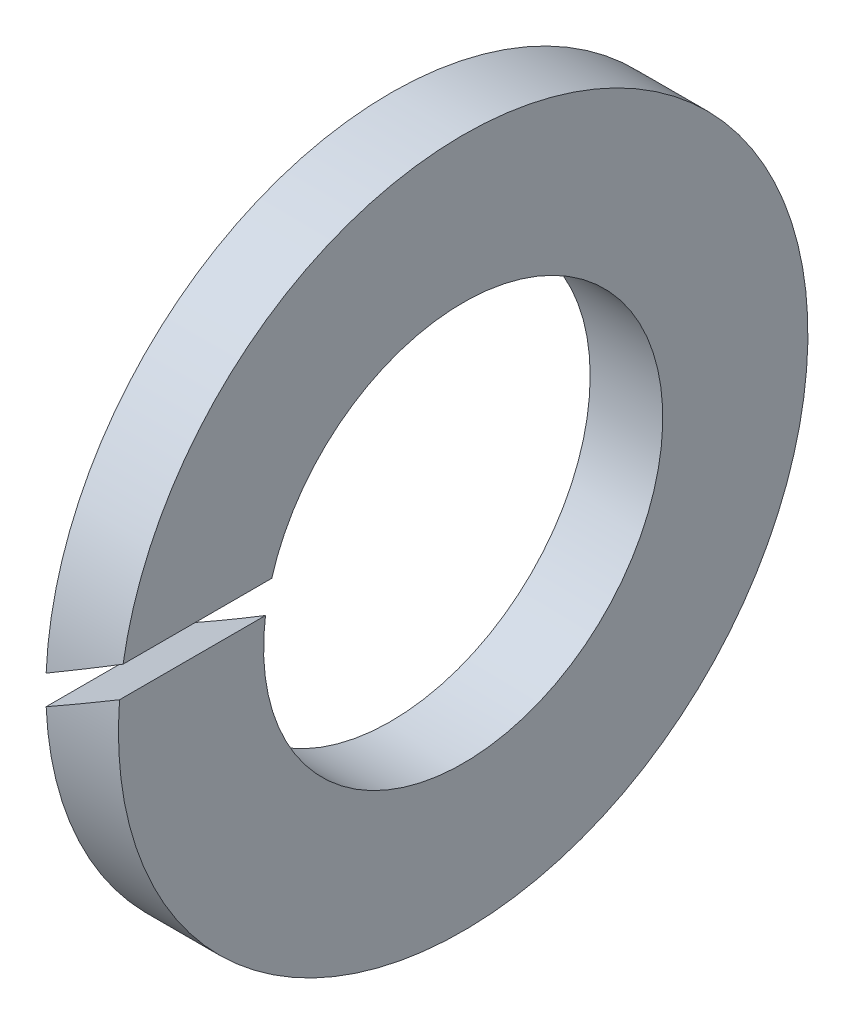
ISO-10303-21;
HEADER;
FILE_DESCRIPTION(('STEP AP214'),'2;1');
FILE_NAME('part.step','',(''),(''),'','','');
FILE_SCHEMA(('AUTOMOTIVE_DESIGN { 1 0 10303 214 1 1 1 1 }'));
ENDSEC;
DATA;
#1=APPLICATION_CONTEXT('core data for automotive mechanical design processes');
#2=APPLICATION_PROTOCOL_DEFINITION('international standard','automotive_design',2000,#1);
#3=PRODUCT_CONTEXT('',#1,'mechanical');
#4=PRODUCT('Part','Part','',(#3));
#5=PRODUCT_RELATED_PRODUCT_CATEGORY('part','',(#4));
#6=PRODUCT_DEFINITION_FORMATION('','',#4);
#7=PRODUCT_DEFINITION_CONTEXT('part definition',#1,'design');
#8=PRODUCT_DEFINITION('design','',#6,#7);
#9=PRODUCT_DEFINITION_SHAPE('','',#8);
#10=(LENGTH_UNIT() NAMED_UNIT(*) SI_UNIT(.MILLI.,.METRE.));
#11=(NAMED_UNIT(*) PLANE_ANGLE_UNIT() SI_UNIT($,.RADIAN.));
#12=(NAMED_UNIT(*) SI_UNIT($,.STERADIAN.) SOLID_ANGLE_UNIT());
#13=UNCERTAINTY_MEASURE_WITH_UNIT(LENGTH_MEASURE(1.E-05),#10,'distance_accuracy_value','');
#14=(GEOMETRIC_REPRESENTATION_CONTEXT(3) GLOBAL_UNCERTAINTY_ASSIGNED_CONTEXT((#13)) GLOBAL_UNIT_ASSIGNED_CONTEXT((#10,
#11,#12)) REPRESENTATION_CONTEXT('',''));
#15=CARTESIAN_POINT('',(0.,0.,0.));
#16=DIRECTION('',(0.,0.,1.));
#17=DIRECTION('',(1.,0.,0.));
#18=AXIS2_PLACEMENT_3D('',#15,#16,#17);
#19=CARTESIAN_POINT('',(0.799999999999999,0.,0.));
#20=DIRECTION('',(-1.,0.,0.));
#21=DIRECTION('',(0.,0.,1.));
#22=AXIS2_PLACEMENT_3D('',#19,#20,#21);
#23=PLANE('',#22);
#24=DIRECTION('',(0.,0.,1.));
#25=VECTOR('',#24,1.);
#26=CARTESIAN_POINT('',(0.799999999999999,0.621880215351698,0.));
#27=LINE('',#26,#25);
#28=CARTESIAN_POINT('',(0.800000000000001,0.6218802153517,2.11027604776108));
#29=VERTEX_POINT('',#28);
#30=CARTESIAN_POINT('',(0.800000000000001,0.6218802153517,3.74876846414314));
#31=VERTEX_POINT('',#30);
#32=EDGE_CURVE('E54',#29,#31,#27,.T.);
#33=ORIENTED_EDGE('',*,*,#32,.F.);
#34=CARTESIAN_POINT('',(0.800000000000002,0.,0.));
#35=DIRECTION('',(1.,0.,0.));
#36=DIRECTION('',(0.,0.,-1.));
#37=AXIS2_PLACEMENT_3D('',#34,#35,#36);
#38=CIRCLE('',#37,2.2);
#39=CARTESIAN_POINT('',(0.800000000000003,0.301880215351698,2.17918983468151));
#40=VERTEX_POINT('',#39);
#41=EDGE_CURVE('E83',#29,#40,#38,.F.);
#42=ORIENTED_EDGE('',*,*,#41,.T.);
#43=DIRECTION('',(0.,0.,1.));
#44=VECTOR('',#43,1.);
#45=CARTESIAN_POINT('',(0.800000000000004,0.301880215351698,0.));
#46=LINE('',#45,#44);
#47=CARTESIAN_POINT('',(0.800000000000003,0.301880215351698,3.78799001260289));
#48=VERTEX_POINT('',#47);
#49=EDGE_CURVE('E85',#40,#48,#46,.T.);
#50=ORIENTED_EDGE('',*,*,#49,.T.);
#51=CARTESIAN_POINT('',(0.800000000000002,0.,0.));
#52=DIRECTION('',(1.,0.,0.));
#53=DIRECTION('',(0.,0.,-1.));
#54=AXIS2_PLACEMENT_3D('',#51,#52,#53);
#55=CIRCLE('',#54,3.8);
#56=EDGE_CURVE('E20',#31,#48,#55,.F.);
#57=ORIENTED_EDGE('',*,*,#56,.F.);
#58=EDGE_LOOP('',(#33,#42,#50,#57));
#59=FACE_BOUND('',#58,.T.);
#60=ADVANCED_FACE('F17',(#59),#23,.F.);
#61=CARTESIAN_POINT('',(0.,0.,0.));
#62=DIRECTION('',(1.,0.,0.));
#63=DIRECTION('',(0.,0.,-1.));
#64=AXIS2_PLACEMENT_3D('',#61,#62,#63);
#65=CYLINDRICAL_SURFACE('',#64,3.8);
#66=ORIENTED_EDGE('',*,*,#56,.T.);
#67=CARTESIAN_POINT('',(0.27712812921103,0.,0.));
#68=DIRECTION('',(0.500000000000001,-0.866025403784438,0.));
#69=DIRECTION('',(0.866025403784438,0.500000000000001,0.));
#70=AXIS2_PLACEMENT_3D('',#67,#68,#69);
#71=ELLIPSE('',#70,7.59999999999998,3.8);
#72=CARTESIAN_POINT('',(0.,-0.160000000000003,3.79663008469353));
#73=VERTEX_POINT('',#72);
#74=EDGE_CURVE('E65',#48,#73,#71,.T.);
#75=ORIENTED_EDGE('',*,*,#74,.T.);
#76=CARTESIAN_POINT('',(0.,0.,0.));
#77=DIRECTION('',(1.,0.,0.));
#78=DIRECTION('',(0.,0.,-1.));
#79=AXIS2_PLACEMENT_3D('',#76,#77,#78);
#80=CIRCLE('',#79,3.8);
#81=CARTESIAN_POINT('',(0.,0.159999999999999,3.79663008469353));
#82=VERTEX_POINT('',#81);
#83=EDGE_CURVE('E60',#82,#73,#80,.F.);
#84=ORIENTED_EDGE('',*,*,#83,.F.);
#85=CARTESIAN_POINT('',(-0.27712812921102,0.,0.));
#86=DIRECTION('',(-0.5,0.866025403784438,0.));
#87=DIRECTION('',(0.866025403784438,0.5,0.));
#88=AXIS2_PLACEMENT_3D('',#85,#86,#87);
#89=ELLIPSE('',#88,7.59999999999999,3.8);
#90=EDGE_CURVE('E63',#82,#31,#89,.T.);
#91=ORIENTED_EDGE('',*,*,#90,.T.);
#92=EDGE_LOOP('',(#66,#75,#84,#91));
#93=FACE_BOUND('',#92,.T.);
#94=ADVANCED_FACE('F62',(#93),#65,.T.);
#95=CARTESIAN_POINT('',(0.800000000000002,0.301880215351697,0.));
#96=DIRECTION('',(0.500000000000001,-0.866025403784438,0.));
#97=DIRECTION('',(0.866025403784438,0.500000000000001,0.));
#98=AXIS2_PLACEMENT_3D('',#95,#96,#97);
#99=PLANE('',#98);
#100=ORIENTED_EDGE('',*,*,#74,.F.);
#101=ORIENTED_EDGE('',*,*,#49,.F.);
#102=CARTESIAN_POINT('',(0.27712812921103,0.,0.));
#103=DIRECTION('',(0.500000000000001,-0.866025403784438,0.));
#104=DIRECTION('',(0.866025403784438,0.500000000000001,0.));
#105=AXIS2_PLACEMENT_3D('',#102,#103,#104);
#106=ELLIPSE('',#105,4.39999999999999,2.2);
#107=CARTESIAN_POINT('',(0.,-0.160000000000003,2.1941741043044));
#108=VERTEX_POINT('',#107);
#109=EDGE_CURVE('E81',#40,#108,#106,.T.);
#110=ORIENTED_EDGE('',*,*,#109,.T.);
#111=DIRECTION('',(0.,0.,1.));
#112=VECTOR('',#111,1.);
#113=CARTESIAN_POINT('',(0.,-0.16,0.));
#114=LINE('',#113,#112);
#115=EDGE_CURVE('E69',#73,#108,#114,.F.);
#116=ORIENTED_EDGE('',*,*,#115,.F.);
#117=EDGE_LOOP('',(#100,#101,#110,#116));
#118=FACE_BOUND('',#117,.T.);
#119=ADVANCED_FACE('F91',(#118),#99,.F.);
#120=CARTESIAN_POINT('',(0.,0.,0.));
#121=DIRECTION('',(1.,0.,0.));
#122=DIRECTION('',(0.,0.,-1.));
#123=AXIS2_PLACEMENT_3D('',#120,#121,#122);
#124=CYLINDRICAL_SURFACE('',#123,2.2);
#125=ORIENTED_EDGE('',*,*,#109,.F.);
#126=ORIENTED_EDGE('',*,*,#41,.F.);
#127=CARTESIAN_POINT('',(-0.27712812921102,0.,0.));
#128=DIRECTION('',(-0.5,0.866025403784438,0.));
#129=DIRECTION('',(0.866025403784438,0.5,0.));
#130=AXIS2_PLACEMENT_3D('',#127,#128,#129);
#131=ELLIPSE('',#130,4.4,2.2);
#132=CARTESIAN_POINT('',(0.,0.159999999999999,2.1941741043044));
#133=VERTEX_POINT('',#132);
#134=EDGE_CURVE('E35',#29,#133,#131,.F.);
#135=ORIENTED_EDGE('',*,*,#134,.T.);
#136=CARTESIAN_POINT('',(0.,0.,0.));
#137=DIRECTION('',(1.,0.,0.));
#138=DIRECTION('',(0.,0.,-1.));
#139=AXIS2_PLACEMENT_3D('',#136,#137,#138);
#140=CIRCLE('',#139,2.2);
#141=EDGE_CURVE('E26',#108,#133,#140,.T.);
#142=ORIENTED_EDGE('',*,*,#141,.F.);
#143=EDGE_LOOP('',(#125,#126,#135,#142));
#144=FACE_BOUND('',#143,.T.);
#145=ADVANCED_FACE('F89',(#144),#124,.F.);
#146=CARTESIAN_POINT('',(0.,0.16,0.));
#147=DIRECTION('',(-0.5,0.866025403784438,0.));
#148=DIRECTION('',(-0.866025403784438,-0.5,0.));
#149=AXIS2_PLACEMENT_3D('',#146,#147,#148);
#150=PLANE('',#149);
#151=ORIENTED_EDGE('',*,*,#90,.F.);
#152=DIRECTION('',(0.,0.,1.));
#153=VECTOR('',#152,1.);
#154=CARTESIAN_POINT('',(0.,0.159999999999999,0.));
#155=LINE('',#154,#153);
#156=EDGE_CURVE('E11',#133,#82,#155,.T.);
#157=ORIENTED_EDGE('',*,*,#156,.F.);
#158=ORIENTED_EDGE('',*,*,#134,.F.);
#159=ORIENTED_EDGE('',*,*,#32,.T.);
#160=EDGE_LOOP('',(#151,#157,#158,#159));
#161=FACE_BOUND('',#160,.T.);
#162=ADVANCED_FACE('F71',(#161),#150,.F.);
#163=CARTESIAN_POINT('',(0.,0.,0.));
#164=DIRECTION('',(-1.,0.,0.));
#165=DIRECTION('',(0.,0.,1.));
#166=AXIS2_PLACEMENT_3D('',#163,#164,#165);
#167=PLANE('',#166);
#168=ORIENTED_EDGE('',*,*,#141,.T.);
#169=ORIENTED_EDGE('',*,*,#156,.T.);
#170=ORIENTED_EDGE('',*,*,#83,.T.);
#171=ORIENTED_EDGE('',*,*,#115,.T.);
#172=EDGE_LOOP('',(#168,#169,#170,#171));
#173=FACE_BOUND('',#172,.T.);
#174=ADVANCED_FACE('F74',(#173),#167,.T.);
#175=CLOSED_SHELL('',(#60,#94,#119,#145,#162,#174));
#176=MANIFOLD_SOLID_BREP('B1',#175);
#177=ADVANCED_BREP_SHAPE_REPRESENTATION('',(#18,#176),#14);
#178=SHAPE_DEFINITION_REPRESENTATION(#9,#177);
ENDSEC;
END-ISO-10303-21;
